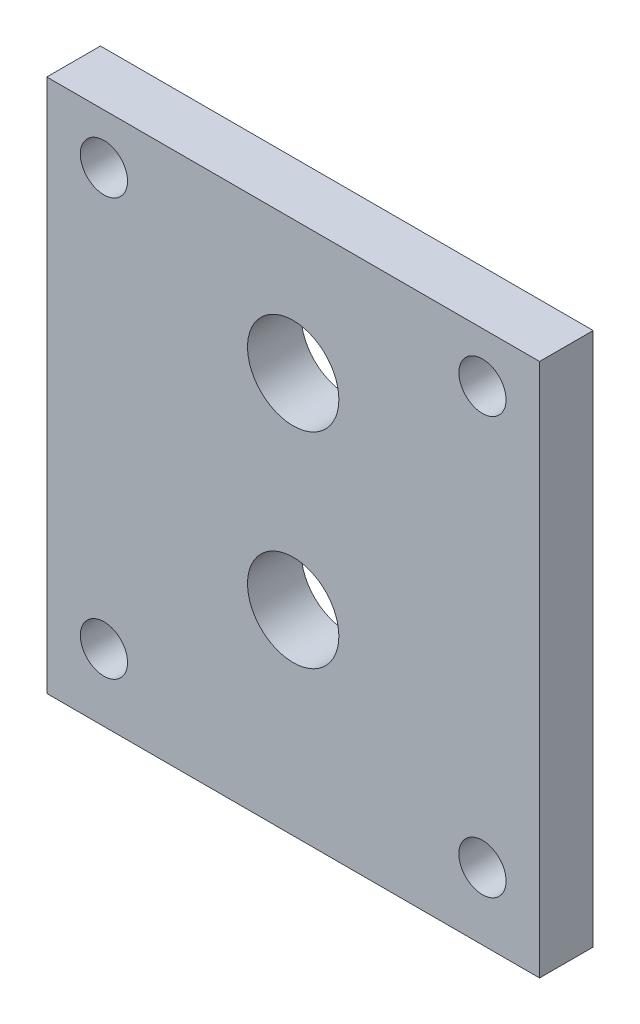
ISO-10303-21;
HEADER;
FILE_DESCRIPTION(('STEP AP214'),'2;1');
FILE_NAME('part.step','',(''),(''),'','','');
FILE_SCHEMA(('AUTOMOTIVE_DESIGN { 1 0 10303 214 1 1 1 1 }'));
ENDSEC;
DATA;
#1=APPLICATION_CONTEXT('core data for automotive mechanical design processes');
#2=APPLICATION_PROTOCOL_DEFINITION('international standard','automotive_design',2000,#1);
#3=PRODUCT_CONTEXT('',#1,'mechanical');
#4=PRODUCT('Part','Part','',(#3));
#5=PRODUCT_RELATED_PRODUCT_CATEGORY('part','',(#4));
#6=PRODUCT_DEFINITION_FORMATION('','',#4);
#7=PRODUCT_DEFINITION_CONTEXT('part definition',#1,'design');
#8=PRODUCT_DEFINITION('design','',#6,#7);
#9=PRODUCT_DEFINITION_SHAPE('','',#8);
#10=(LENGTH_UNIT() NAMED_UNIT(*) SI_UNIT(.MILLI.,.METRE.));
#11=(NAMED_UNIT(*) PLANE_ANGLE_UNIT() SI_UNIT($,.RADIAN.));
#12=(NAMED_UNIT(*) SI_UNIT($,.STERADIAN.) SOLID_ANGLE_UNIT());
#13=UNCERTAINTY_MEASURE_WITH_UNIT(LENGTH_MEASURE(1.E-05),#10,'distance_accuracy_value','');
#14=(GEOMETRIC_REPRESENTATION_CONTEXT(3) GLOBAL_UNCERTAINTY_ASSIGNED_CONTEXT((#13)) GLOBAL_UNIT_ASSIGNED_CONTEXT((#10,
#11,#12)) REPRESENTATION_CONTEXT('',''));
#15=CARTESIAN_POINT('',(0.,0.,0.));
#16=DIRECTION('',(0.,0.,1.));
#17=DIRECTION('',(1.,0.,0.));
#18=AXIS2_PLACEMENT_3D('',#15,#16,#17);
#19=CARTESIAN_POINT('',(0.,0.,3.175));
#20=DIRECTION('',(0.,0.,-1.));
#21=DIRECTION('',(-1.,0.,0.));
#22=AXIS2_PLACEMENT_3D('',#19,#20,#21);
#23=PLANE('',#22);
#24=CARTESIAN_POINT('',(3.22086547923458,-25.1066840960137,3.175));
#25=DIRECTION('',(0.,0.,1.));
#26=DIRECTION('',(1.,0.,0.));
#27=AXIS2_PLACEMENT_3D('',#24,#25,#26);
#28=CIRCLE('',#27,1.397);
#29=CARTESIAN_POINT('',(4.61786547923458,-25.1066840960137,3.175));
#30=VERTEX_POINT('',#29);
#31=EDGE_CURVE('E133',#30,#30,#28,.T.);
#32=ORIENTED_EDGE('',*,*,#31,.F.);
#33=EDGE_LOOP('',(#32));
#34=FACE_BOUND('',#33,.T.);
#35=CARTESIAN_POINT('',(25.6363977372346,-0.422913296013645,3.175));
#36=DIRECTION('',(0.,0.,1.));
#37=DIRECTION('',(1.,0.,0.));
#38=AXIS2_PLACEMENT_3D('',#35,#36,#37);
#39=CIRCLE('',#38,1.397);
#40=CARTESIAN_POINT('',(27.0333977372346,-0.422913296013645,3.175));
#41=VERTEX_POINT('',#40);
#42=EDGE_CURVE('E121',#41,#41,#39,.T.);
#43=ORIENTED_EDGE('',*,*,#42,.F.);
#44=EDGE_LOOP('',(#43));
#45=FACE_BOUND('',#44,.T.);
#46=CARTESIAN_POINT('',(14.4286316082346,-17.5014140640136,3.175));
#47=DIRECTION('',(0.,0.,1.));
#48=DIRECTION('',(1.,0.,0.));
#49=AXIS2_PLACEMENT_3D('',#46,#47,#48);
#50=CIRCLE('',#49,2.704093906);
#51=CARTESIAN_POINT('',(17.1327255142346,-17.5014140640136,3.175));
#52=VERTEX_POINT('',#51);
#53=EDGE_CURVE('E100',#52,#52,#50,.T.);
#54=ORIENTED_EDGE('',*,*,#53,.F.);
#55=EDGE_LOOP('',(#54));
#56=FACE_BOUND('',#55,.T.);
#57=DIRECTION('',(0.,-1.,0.));
#58=VECTOR('',#57,1.);
#59=CARTESIAN_POINT('',(-0.162758092130662,-29.0838313851706,3.175));
#60=LINE('',#59,#58);
#61=CARTESIAN_POINT('',(-0.162758092130662,2.53590869605556,3.175));
#62=VERTEX_POINT('',#61);
#63=CARTESIAN_POINT('',(-0.162758092130662,-29.0838313851706,3.175));
#64=VERTEX_POINT('',#63);
#65=EDGE_CURVE('E85',#62,#64,#60,.T.);
#66=ORIENTED_EDGE('',*,*,#65,.T.);
#67=DIRECTION('',(1.,0.,0.));
#68=VECTOR('',#67,1.);
#69=CARTESIAN_POINT('',(-0.162758092130662,-29.0838313851706,3.175));
#70=LINE('',#69,#68);
#71=CARTESIAN_POINT('',(29.0200213085998,-29.0838313851706,3.175));
#72=VERTEX_POINT('',#71);
#73=EDGE_CURVE('E80',#64,#72,#70,.T.);
#74=ORIENTED_EDGE('',*,*,#73,.T.);
#75=DIRECTION('',(0.,1.,0.));
#76=VECTOR('',#75,1.);
#77=CARTESIAN_POINT('',(29.0200213085998,-29.0838313851706,3.175));
#78=LINE('',#77,#76);
#79=CARTESIAN_POINT('',(29.0200213085998,2.53590869605556,3.175));
#80=VERTEX_POINT('',#79);
#81=EDGE_CURVE('E83',#72,#80,#78,.T.);
#82=ORIENTED_EDGE('',*,*,#81,.T.);
#83=DIRECTION('',(-1.,0.,0.));
#84=VECTOR('',#83,1.);
#85=CARTESIAN_POINT('',(-0.162758092130662,2.53590869605556,3.175));
#86=LINE('',#85,#84);
#87=EDGE_CURVE('E50',#80,#62,#86,.T.);
#88=ORIENTED_EDGE('',*,*,#87,.T.);
#89=EDGE_LOOP('',(#66,#74,#82,#88));
#90=FACE_BOUND('',#89,.T.);
#91=CARTESIAN_POINT('',(3.22086547923459,-0.422913296013645,3.175));
#92=DIRECTION('',(0.,0.,1.));
#93=DIRECTION('',(1.,0.,0.));
#94=AXIS2_PLACEMENT_3D('',#91,#92,#93);
#95=CIRCLE('',#94,1.397);
#96=CARTESIAN_POINT('',(4.61786547923459,-0.422913296013645,3.175));
#97=VERTEX_POINT('',#96);
#98=EDGE_CURVE('E115',#97,#97,#95,.T.);
#99=ORIENTED_EDGE('',*,*,#98,.F.);
#100=EDGE_LOOP('',(#99));
#101=FACE_BOUND('',#100,.T.);
#102=CARTESIAN_POINT('',(25.6363977372346,-25.1066840960137,3.175));
#103=DIRECTION('',(0.,0.,1.));
#104=DIRECTION('',(1.,0.,0.));
#105=AXIS2_PLACEMENT_3D('',#102,#103,#104);
#106=CIRCLE('',#105,1.397);
#107=CARTESIAN_POINT('',(27.0333977372346,-25.1066840960137,3.175));
#108=VERTEX_POINT('',#107);
#109=EDGE_CURVE('E127',#108,#108,#106,.T.);
#110=ORIENTED_EDGE('',*,*,#109,.F.);
#111=EDGE_LOOP('',(#110));
#112=FACE_BOUND('',#111,.T.);
#113=CARTESIAN_POINT('',(14.4286316082346,-5.35966745601365,3.175));
#114=DIRECTION('',(0.,0.,1.));
#115=DIRECTION('',(1.,0.,0.));
#116=AXIS2_PLACEMENT_3D('',#113,#114,#115);
#117=CIRCLE('',#116,2.70409387831448);
#118=CARTESIAN_POINT('',(17.1327254865491,-5.35966745601365,3.175));
#119=VERTEX_POINT('',#118);
#120=EDGE_CURVE('E139',#119,#119,#117,.T.);
#121=ORIENTED_EDGE('',*,*,#120,.F.);
#122=EDGE_LOOP('',(#121));
#123=FACE_BOUND('',#122,.T.);
#124=ADVANCED_FACE('F33',(#34,#45,#56,#90,#101,#112,#123),#23,.F.);
#125=CARTESIAN_POINT('',(0.,0.,0.));
#126=DIRECTION('',(0.,0.,-1.));
#127=DIRECTION('',(-1.,0.,0.));
#128=AXIS2_PLACEMENT_3D('',#125,#126,#127);
#129=PLANE('',#128);
#130=CARTESIAN_POINT('',(3.22086547923458,-25.1066840960137,0.));
#131=DIRECTION('',(0.,0.,1.));
#132=DIRECTION('',(1.,0.,0.));
#133=AXIS2_PLACEMENT_3D('',#130,#131,#132);
#134=CIRCLE('',#133,1.397);
#135=CARTESIAN_POINT('',(4.61786547923458,-25.1066840960137,0.));
#136=VERTEX_POINT('',#135);
#137=EDGE_CURVE('E136',#136,#136,#134,.T.);
#138=ORIENTED_EDGE('',*,*,#137,.T.);
#139=EDGE_LOOP('',(#138));
#140=FACE_BOUND('',#139,.T.);
#141=CARTESIAN_POINT('',(25.6363977372346,-0.422913296013645,0.));
#142=DIRECTION('',(0.,0.,1.));
#143=DIRECTION('',(1.,0.,0.));
#144=AXIS2_PLACEMENT_3D('',#141,#142,#143);
#145=CIRCLE('',#144,1.397);
#146=CARTESIAN_POINT('',(27.0333977372346,-0.422913296013645,0.));
#147=VERTEX_POINT('',#146);
#148=EDGE_CURVE('E124',#147,#147,#145,.T.);
#149=ORIENTED_EDGE('',*,*,#148,.T.);
#150=EDGE_LOOP('',(#149));
#151=FACE_BOUND('',#150,.T.);
#152=CARTESIAN_POINT('',(14.4286316082346,-17.5014140640136,0.));
#153=DIRECTION('',(0.,0.,1.));
#154=DIRECTION('',(1.,0.,0.));
#155=AXIS2_PLACEMENT_3D('',#152,#153,#154);
#156=CIRCLE('',#155,2.704093906);
#157=CARTESIAN_POINT('',(17.1327255142346,-17.5014140640136,0.));
#158=VERTEX_POINT('',#157);
#159=EDGE_CURVE('E112',#158,#158,#156,.T.);
#160=ORIENTED_EDGE('',*,*,#159,.T.);
#161=EDGE_LOOP('',(#160));
#162=FACE_BOUND('',#161,.T.);
#163=DIRECTION('',(0.,-1.,0.));
#164=VECTOR('',#163,1.);
#165=CARTESIAN_POINT('',(-0.162758092130662,-29.0838313851706,0.));
#166=LINE('',#165,#164);
#167=CARTESIAN_POINT('',(-0.162758092130662,2.53590869605556,0.));
#168=VERTEX_POINT('',#167);
#169=CARTESIAN_POINT('',(-0.162758092130662,-29.0838313851706,0.));
#170=VERTEX_POINT('',#169);
#171=EDGE_CURVE('E97',#168,#170,#166,.T.);
#172=ORIENTED_EDGE('',*,*,#171,.F.);
#173=DIRECTION('',(-1.,0.,0.));
#174=VECTOR('',#173,1.);
#175=CARTESIAN_POINT('',(-0.162758092130662,2.53590869605556,0.));
#176=LINE('',#175,#174);
#177=CARTESIAN_POINT('',(29.0200213085998,2.53590869605556,0.));
#178=VERTEX_POINT('',#177);
#179=EDGE_CURVE('E73',#178,#168,#176,.T.);
#180=ORIENTED_EDGE('',*,*,#179,.F.);
#181=DIRECTION('',(0.,1.,0.));
#182=VECTOR('',#181,1.);
#183=CARTESIAN_POINT('',(29.0200213085998,-29.0838313851706,0.));
#184=LINE('',#183,#182);
#185=CARTESIAN_POINT('',(29.0200213085998,-29.0838313851706,0.));
#186=VERTEX_POINT('',#185);
#187=EDGE_CURVE('E67',#186,#178,#184,.T.);
#188=ORIENTED_EDGE('',*,*,#187,.F.);
#189=DIRECTION('',(1.,0.,0.));
#190=VECTOR('',#189,1.);
#191=CARTESIAN_POINT('',(-0.162758092130662,-29.0838313851706,0.));
#192=LINE('',#191,#190);
#193=EDGE_CURVE('E89',#170,#186,#192,.T.);
#194=ORIENTED_EDGE('',*,*,#193,.F.);
#195=EDGE_LOOP('',(#172,#180,#188,#194));
#196=FACE_BOUND('',#195,.T.);
#197=CARTESIAN_POINT('',(3.22086547923459,-0.422913296013645,0.));
#198=DIRECTION('',(0.,0.,1.));
#199=DIRECTION('',(1.,0.,0.));
#200=AXIS2_PLACEMENT_3D('',#197,#198,#199);
#201=CIRCLE('',#200,1.397);
#202=CARTESIAN_POINT('',(4.61786547923459,-0.422913296013645,0.));
#203=VERTEX_POINT('',#202);
#204=EDGE_CURVE('E118',#203,#203,#201,.T.);
#205=ORIENTED_EDGE('',*,*,#204,.T.);
#206=EDGE_LOOP('',(#205));
#207=FACE_BOUND('',#206,.T.);
#208=CARTESIAN_POINT('',(25.6363977372346,-25.1066840960137,0.));
#209=DIRECTION('',(0.,0.,1.));
#210=DIRECTION('',(1.,0.,0.));
#211=AXIS2_PLACEMENT_3D('',#208,#209,#210);
#212=CIRCLE('',#211,1.397);
#213=CARTESIAN_POINT('',(27.0333977372346,-25.1066840960137,0.));
#214=VERTEX_POINT('',#213);
#215=EDGE_CURVE('E130',#214,#214,#212,.T.);
#216=ORIENTED_EDGE('',*,*,#215,.T.);
#217=EDGE_LOOP('',(#216));
#218=FACE_BOUND('',#217,.T.);
#219=CARTESIAN_POINT('',(14.4286316082346,-5.35966745601365,0.));
#220=DIRECTION('',(0.,0.,1.));
#221=DIRECTION('',(1.,0.,0.));
#222=AXIS2_PLACEMENT_3D('',#219,#220,#221);
#223=CIRCLE('',#222,2.70409387831448);
#224=CARTESIAN_POINT('',(17.1327254865491,-5.35966745601365,0.));
#225=VERTEX_POINT('',#224);
#226=EDGE_CURVE('E142',#225,#225,#223,.T.);
#227=ORIENTED_EDGE('',*,*,#226,.T.);
#228=EDGE_LOOP('',(#227));
#229=FACE_BOUND('',#228,.T.);
#230=ADVANCED_FACE('F108',(#140,#151,#162,#196,#207,#218,#229),#129,.T.);
#231=CARTESIAN_POINT('',(-0.162758092130662,-29.0838313851706,3.175));
#232=DIRECTION('',(1.,0.,0.));
#233=DIRECTION('',(0.,0.,-1.));
#234=AXIS2_PLACEMENT_3D('',#231,#232,#233);
#235=PLANE('',#234);
#236=ORIENTED_EDGE('',*,*,#171,.T.);
#237=DIRECTION('',(0.,0.,-1.));
#238=VECTOR('',#237,1.);
#239=CARTESIAN_POINT('',(-0.162758092130662,-29.0838313851706,3.175));
#240=LINE('',#239,#238);
#241=EDGE_CURVE('E11',#64,#170,#240,.T.);
#242=ORIENTED_EDGE('',*,*,#241,.F.);
#243=ORIENTED_EDGE('',*,*,#65,.F.);
#244=DIRECTION('',(0.,0.,-1.));
#245=VECTOR('',#244,1.);
#246=CARTESIAN_POINT('',(-0.162758092130662,2.53590869605556,3.175));
#247=LINE('',#246,#245);
#248=EDGE_CURVE('E93',#62,#168,#247,.T.);
#249=ORIENTED_EDGE('',*,*,#248,.T.);
#250=EDGE_LOOP('',(#236,#242,#243,#249));
#251=FACE_BOUND('',#250,.T.);
#252=ADVANCED_FACE('F35',(#251),#235,.F.);
#253=CARTESIAN_POINT('',(-0.162758092130662,-29.0838313851706,3.175));
#254=DIRECTION('',(0.,1.,0.));
#255=DIRECTION('',(-1.,0.,0.));
#256=AXIS2_PLACEMENT_3D('',#253,#254,#255);
#257=PLANE('',#256);
#258=ORIENTED_EDGE('',*,*,#193,.T.);
#259=DIRECTION('',(0.,0.,-1.));
#260=VECTOR('',#259,1.);
#261=CARTESIAN_POINT('',(29.0200213085998,-29.0838313851706,3.175));
#262=LINE('',#261,#260);
#263=EDGE_CURVE('E42',#72,#186,#262,.T.);
#264=ORIENTED_EDGE('',*,*,#263,.F.);
#265=ORIENTED_EDGE('',*,*,#73,.F.);
#266=ORIENTED_EDGE('',*,*,#241,.T.);
#267=EDGE_LOOP('',(#258,#264,#265,#266));
#268=FACE_BOUND('',#267,.T.);
#269=ADVANCED_FACE('F88',(#268),#257,.F.);
#270=CARTESIAN_POINT('',(29.0200213085998,-29.0838313851706,3.175));
#271=DIRECTION('',(-1.,0.,0.));
#272=DIRECTION('',(0.,-1.,0.));
#273=AXIS2_PLACEMENT_3D('',#270,#271,#272);
#274=PLANE('',#273);
#275=ORIENTED_EDGE('',*,*,#187,.T.);
#276=DIRECTION('',(0.,0.,-1.));
#277=VECTOR('',#276,1.);
#278=CARTESIAN_POINT('',(29.0200213085998,2.53590869605556,3.175));
#279=LINE('',#278,#277);
#280=EDGE_CURVE('E90',#80,#178,#279,.T.);
#281=ORIENTED_EDGE('',*,*,#280,.F.);
#282=ORIENTED_EDGE('',*,*,#81,.F.);
#283=ORIENTED_EDGE('',*,*,#263,.T.);
#284=EDGE_LOOP('',(#275,#281,#282,#283));
#285=FACE_BOUND('',#284,.T.);
#286=ADVANCED_FACE('F91',(#285),#274,.F.);
#287=CARTESIAN_POINT('',(-0.162758092130662,2.53590869605556,3.175));
#288=DIRECTION('',(0.,-1.,0.));
#289=DIRECTION('',(1.,0.,0.));
#290=AXIS2_PLACEMENT_3D('',#287,#288,#289);
#291=PLANE('',#290);
#292=ORIENTED_EDGE('',*,*,#179,.T.);
#293=ORIENTED_EDGE('',*,*,#248,.F.);
#294=ORIENTED_EDGE('',*,*,#87,.F.);
#295=ORIENTED_EDGE('',*,*,#280,.T.);
#296=EDGE_LOOP('',(#292,#293,#294,#295));
#297=FACE_BOUND('',#296,.T.);
#298=ADVANCED_FACE('F105',(#297),#291,.F.);
#299=CARTESIAN_POINT('',(14.4286316082346,-17.5014140640136,3.175));
#300=DIRECTION('',(0.,0.,-1.));
#301=DIRECTION('',(-1.,0.,0.));
#302=AXIS2_PLACEMENT_3D('',#299,#300,#301);
#303=CYLINDRICAL_SURFACE('',#302,2.704093906);
#304=ORIENTED_EDGE('',*,*,#53,.T.);
#305=EDGE_LOOP('',(#304));
#306=FACE_BOUND('',#305,.T.);
#307=ORIENTED_EDGE('',*,*,#159,.F.);
#308=EDGE_LOOP('',(#307));
#309=FACE_BOUND('',#308,.T.);
#310=ADVANCED_FACE('F162',(#306,#309),#303,.F.);
#311=CARTESIAN_POINT('',(3.22086547923459,-0.422913296013645,3.175));
#312=DIRECTION('',(0.,0.,-1.));
#313=DIRECTION('',(-1.,0.,0.));
#314=AXIS2_PLACEMENT_3D('',#311,#312,#313);
#315=CYLINDRICAL_SURFACE('',#314,1.397);
#316=ORIENTED_EDGE('',*,*,#98,.T.);
#317=EDGE_LOOP('',(#316));
#318=FACE_BOUND('',#317,.T.);
#319=ORIENTED_EDGE('',*,*,#204,.F.);
#320=EDGE_LOOP('',(#319));
#321=FACE_BOUND('',#320,.T.);
#322=ADVANCED_FACE('F208',(#318,#321),#315,.F.);
#323=CARTESIAN_POINT('',(25.6363977372346,-0.422913296013645,3.175));
#324=DIRECTION('',(0.,0.,-1.));
#325=DIRECTION('',(-1.,0.,0.));
#326=AXIS2_PLACEMENT_3D('',#323,#324,#325);
#327=CYLINDRICAL_SURFACE('',#326,1.397);
#328=ORIENTED_EDGE('',*,*,#42,.T.);
#329=EDGE_LOOP('',(#328));
#330=FACE_BOUND('',#329,.T.);
#331=ORIENTED_EDGE('',*,*,#148,.F.);
#332=EDGE_LOOP('',(#331));
#333=FACE_BOUND('',#332,.T.);
#334=ADVANCED_FACE('F216',(#330,#333),#327,.F.);
#335=CARTESIAN_POINT('',(25.6363977372346,-25.1066840960137,3.175));
#336=DIRECTION('',(0.,0.,-1.));
#337=DIRECTION('',(-1.,0.,0.));
#338=AXIS2_PLACEMENT_3D('',#335,#336,#337);
#339=CYLINDRICAL_SURFACE('',#338,1.397);
#340=ORIENTED_EDGE('',*,*,#109,.T.);
#341=EDGE_LOOP('',(#340));
#342=FACE_BOUND('',#341,.T.);
#343=ORIENTED_EDGE('',*,*,#215,.F.);
#344=EDGE_LOOP('',(#343));
#345=FACE_BOUND('',#344,.T.);
#346=ADVANCED_FACE('F224',(#342,#345),#339,.F.);
#347=CARTESIAN_POINT('',(3.22086547923458,-25.1066840960137,3.175));
#348=DIRECTION('',(0.,0.,-1.));
#349=DIRECTION('',(-1.,0.,0.));
#350=AXIS2_PLACEMENT_3D('',#347,#348,#349);
#351=CYLINDRICAL_SURFACE('',#350,1.397);
#352=ORIENTED_EDGE('',*,*,#31,.T.);
#353=EDGE_LOOP('',(#352));
#354=FACE_BOUND('',#353,.T.);
#355=ORIENTED_EDGE('',*,*,#137,.F.);
#356=EDGE_LOOP('',(#355));
#357=FACE_BOUND('',#356,.T.);
#358=ADVANCED_FACE('F233',(#354,#357),#351,.F.);
#359=CARTESIAN_POINT('',(14.4286316082346,-5.35966745601365,3.175));
#360=DIRECTION('',(0.,0.,-1.));
#361=DIRECTION('',(-1.,0.,0.));
#362=AXIS2_PLACEMENT_3D('',#359,#360,#361);
#363=CYLINDRICAL_SURFACE('',#362,2.70409387831448);
#364=ORIENTED_EDGE('',*,*,#120,.T.);
#365=EDGE_LOOP('',(#364));
#366=FACE_BOUND('',#365,.T.);
#367=ORIENTED_EDGE('',*,*,#226,.F.);
#368=EDGE_LOOP('',(#367));
#369=FACE_BOUND('',#368,.T.);
#370=ADVANCED_FACE('F148',(#366,#369),#363,.F.);
#371=CLOSED_SHELL('',(#124,#230,#252,#269,#286,#298,#310,#322,#334,#346,#358,#370));
#372=MANIFOLD_SOLID_BREP('B2',#371);
#373=ADVANCED_BREP_SHAPE_REPRESENTATION('',(#18,#372),#14);
#374=SHAPE_DEFINITION_REPRESENTATION(#9,#373);
ENDSEC;
END-ISO-10303-21;
